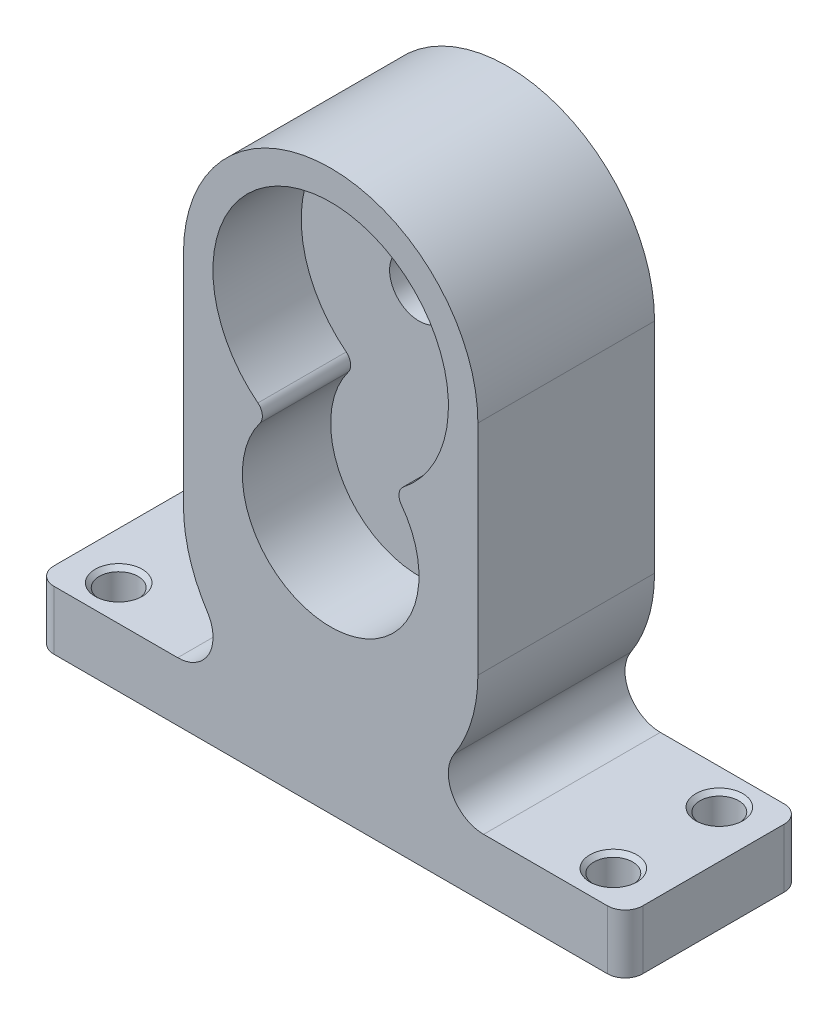
ISO-10303-21;
HEADER;
FILE_DESCRIPTION(('STEP AP214'),'2;1');
FILE_NAME('part.step','',(''),(''),'','','');
FILE_SCHEMA(('AUTOMOTIVE_DESIGN { 1 0 10303 214 1 1 1 1 }'));
ENDSEC;
DATA;
#1=APPLICATION_CONTEXT('core data for automotive mechanical design processes');
#2=APPLICATION_PROTOCOL_DEFINITION('international standard','automotive_design',2000,#1);
#3=PRODUCT_CONTEXT('',#1,'mechanical');
#4=PRODUCT('Part','Part','',(#3));
#5=PRODUCT_RELATED_PRODUCT_CATEGORY('part','',(#4));
#6=PRODUCT_DEFINITION_FORMATION('','',#4);
#7=PRODUCT_DEFINITION_CONTEXT('part definition',#1,'design');
#8=PRODUCT_DEFINITION('design','',#6,#7);
#9=PRODUCT_DEFINITION_SHAPE('','',#8);
#10=(LENGTH_UNIT() NAMED_UNIT(*) SI_UNIT(.MILLI.,.METRE.));
#11=(NAMED_UNIT(*) PLANE_ANGLE_UNIT() SI_UNIT($,.RADIAN.));
#12=(NAMED_UNIT(*) SI_UNIT($,.STERADIAN.) SOLID_ANGLE_UNIT());
#13=UNCERTAINTY_MEASURE_WITH_UNIT(LENGTH_MEASURE(1.E-05),#10,'distance_accuracy_value','');
#14=(GEOMETRIC_REPRESENTATION_CONTEXT(3) GLOBAL_UNCERTAINTY_ASSIGNED_CONTEXT((#13)) GLOBAL_UNIT_ASSIGNED_CONTEXT((#10,
#11,#12)) REPRESENTATION_CONTEXT('',''));
#15=CARTESIAN_POINT('',(0.,0.,0.));
#16=DIRECTION('',(0.,0.,1.));
#17=DIRECTION('',(1.,0.,0.));
#18=AXIS2_PLACEMENT_3D('',#15,#16,#17);
#19=CARTESIAN_POINT('',(-25.9798872533611,16.,-30.));
#20=DIRECTION('',(0.,0.,1.));
#21=DIRECTION('',(1.,0.,0.));
#22=AXIS2_PLACEMENT_3D('',#19,#20,#21);
#23=CYLINDRICAL_SURFACE('',#22,6.);
#24=DIRECTION('',(0.,0.,-1.));
#25=VECTOR('',#24,1.);
#26=CARTESIAN_POINT('',(-25.9798872533611,10.,-30.));
#27=LINE('',#26,#25);
#28=CARTESIAN_POINT('',(-25.9798872533611,10.,0.));
#29=VERTEX_POINT('',#28);
#30=CARTESIAN_POINT('',(-25.9798872533611,10.,-30.));
#31=VERTEX_POINT('',#30);
#32=EDGE_CURVE('E246',#29,#31,#27,.T.);
#33=ORIENTED_EDGE('',*,*,#32,.F.);
#34=CARTESIAN_POINT('',(-25.9798872533611,16.,0.));
#35=DIRECTION('',(0.,0.,-1.));
#36=DIRECTION('',(-1.,0.,0.));
#37=AXIS2_PLACEMENT_3D('',#34,#35,#36);
#38=CIRCLE('',#37,6.);
#39=CARTESIAN_POINT('',(-20.951521978517,19.2734603499573,0.));
#40=VERTEX_POINT('',#39);
#41=EDGE_CURVE('E252',#29,#40,#38,.F.);
#42=ORIENTED_EDGE('',*,*,#41,.T.);
#43=DIRECTION('',(0.,0.,1.));
#44=VECTOR('',#43,1.);
#45=CARTESIAN_POINT('',(-20.951521978517,19.2734603499573,-30.));
#46=LINE('',#45,#44);
#47=CARTESIAN_POINT('',(-20.951521978517,19.2734603499573,-30.));
#48=VERTEX_POINT('',#47);
#49=EDGE_CURVE('E249',#48,#40,#46,.T.);
#50=ORIENTED_EDGE('',*,*,#49,.F.);
#51=CARTESIAN_POINT('',(-25.9798872533611,16.,-30.));
#52=DIRECTION('',(0.,0.,-1.));
#53=DIRECTION('',(-1.,0.,0.));
#54=AXIS2_PLACEMENT_3D('',#51,#52,#53);
#55=CIRCLE('',#54,6.);
#56=EDGE_CURVE('E254',#48,#31,#55,.T.);
#57=ORIENTED_EDGE('',*,*,#56,.T.);
#58=EDGE_LOOP('',(#33,#42,#50,#57));
#59=FACE_BOUND('',#58,.T.);
#60=ADVANCED_FACE('F34',(#59),#23,.F.);
#61=CARTESIAN_POINT('',(25.9798872533611,16.,-30.));
#62=DIRECTION('',(0.,0.,1.));
#63=DIRECTION('',(1.,0.,0.));
#64=AXIS2_PLACEMENT_3D('',#61,#62,#63);
#65=CYLINDRICAL_SURFACE('',#64,6.);
#66=DIRECTION('',(0.,0.,-1.));
#67=VECTOR('',#66,1.);
#68=CARTESIAN_POINT('',(25.9798872533611,10.,-30.));
#69=LINE('',#68,#67);
#70=CARTESIAN_POINT('',(25.9798872533611,10.,-30.));
#71=VERTEX_POINT('',#70);
#72=CARTESIAN_POINT('',(25.9798872533611,10.,0.));
#73=VERTEX_POINT('',#72);
#74=EDGE_CURVE('E228',#71,#73,#69,.F.);
#75=ORIENTED_EDGE('',*,*,#74,.F.);
#76=CARTESIAN_POINT('',(25.9798872533611,16.,-30.));
#77=DIRECTION('',(0.,0.,-1.));
#78=DIRECTION('',(-1.,0.,0.));
#79=AXIS2_PLACEMENT_3D('',#76,#77,#78);
#80=CIRCLE('',#79,6.);
#81=CARTESIAN_POINT('',(20.951521978517,19.2734603499573,-30.));
#82=VERTEX_POINT('',#81);
#83=EDGE_CURVE('E241',#71,#82,#80,.T.);
#84=ORIENTED_EDGE('',*,*,#83,.T.);
#85=DIRECTION('',(0.,0.,1.));
#86=VECTOR('',#85,1.);
#87=CARTESIAN_POINT('',(20.951521978517,19.2734603499573,-30.));
#88=LINE('',#87,#86);
#89=CARTESIAN_POINT('',(20.951521978517,19.2734603499573,0.));
#90=VERTEX_POINT('',#89);
#91=EDGE_CURVE('E238',#90,#82,#88,.F.);
#92=ORIENTED_EDGE('',*,*,#91,.F.);
#93=CARTESIAN_POINT('',(25.9798872533611,16.,0.));
#94=DIRECTION('',(0.,0.,-1.));
#95=DIRECTION('',(-1.,0.,0.));
#96=AXIS2_PLACEMENT_3D('',#93,#94,#95);
#97=CIRCLE('',#96,6.);
#98=EDGE_CURVE('E243',#90,#73,#97,.F.);
#99=ORIENTED_EDGE('',*,*,#98,.T.);
#100=EDGE_LOOP('',(#75,#84,#92,#99));
#101=FACE_BOUND('',#100,.T.);
#102=ADVANCED_FACE('F422',(#101),#65,.F.);
#103=CARTESIAN_POINT('',(0.,0.,-30.));
#104=DIRECTION('',(0.,-1.,0.));
#105=DIRECTION('',(0.,0.,-1.));
#106=AXIS2_PLACEMENT_3D('',#103,#104,#105);
#107=PLANE('',#106);
#108=CARTESIAN_POINT('',(-42.,0.,-6.));
#109=DIRECTION('',(0.,1.,0.));
#110=DIRECTION('',(0.,0.,1.));
#111=AXIS2_PLACEMENT_3D('',#108,#109,#110);
#112=CIRCLE('',#111,3.29999999999998);
#113=CARTESIAN_POINT('',(-42.,0.,-2.70000000000002));
#114=VERTEX_POINT('',#113);
#115=EDGE_CURVE('E386',#114,#114,#112,.T.);
#116=ORIENTED_EDGE('',*,*,#115,.T.);
#117=EDGE_LOOP('',(#116));
#118=FACE_BOUND('',#117,.T.);
#119=CARTESIAN_POINT('',(42.,0.,-6.));
#120=DIRECTION('',(0.,1.,0.));
#121=DIRECTION('',(0.,0.,1.));
#122=AXIS2_PLACEMENT_3D('',#119,#120,#121);
#123=CIRCLE('',#122,3.29999999999998);
#124=CARTESIAN_POINT('',(42.,0.,-2.70000000000002));
#125=VERTEX_POINT('',#124);
#126=EDGE_CURVE('E377',#125,#125,#123,.T.);
#127=ORIENTED_EDGE('',*,*,#126,.T.);
#128=EDGE_LOOP('',(#127));
#129=FACE_BOUND('',#128,.T.);
#130=CARTESIAN_POINT('',(-42.,0.,-24.));
#131=DIRECTION('',(0.,1.,0.));
#132=DIRECTION('',(0.,0.,1.));
#133=AXIS2_PLACEMENT_3D('',#130,#131,#132);
#134=CIRCLE('',#133,3.29999999999998);
#135=CARTESIAN_POINT('',(-42.,0.,-20.7));
#136=VERTEX_POINT('',#135);
#137=EDGE_CURVE('E368',#136,#136,#134,.T.);
#138=ORIENTED_EDGE('',*,*,#137,.T.);
#139=EDGE_LOOP('',(#138));
#140=FACE_BOUND('',#139,.T.);
#141=CARTESIAN_POINT('',(42.,0.,-24.));
#142=DIRECTION('',(0.,1.,0.));
#143=DIRECTION('',(0.,0.,1.));
#144=AXIS2_PLACEMENT_3D('',#141,#142,#143);
#145=CIRCLE('',#144,3.29999999999998);
#146=CARTESIAN_POINT('',(42.,0.,-20.7));
#147=VERTEX_POINT('',#146);
#148=EDGE_CURVE('E357',#147,#147,#145,.T.);
#149=ORIENTED_EDGE('',*,*,#148,.T.);
#150=EDGE_LOOP('',(#149));
#151=FACE_BOUND('',#150,.T.);
#152=DIRECTION('',(0.,0.,1.));
#153=VECTOR('',#152,1.);
#154=CARTESIAN_POINT('',(-50.,0.,-30.));
#155=LINE('',#154,#153);
#156=CARTESIAN_POINT('',(-50.,0.,-27.));
#157=VERTEX_POINT('',#156);
#158=CARTESIAN_POINT('',(-50.,0.,-3.));
#159=VERTEX_POINT('',#158);
#160=EDGE_CURVE('E219',#157,#159,#155,.T.);
#161=ORIENTED_EDGE('',*,*,#160,.F.);
#162=CARTESIAN_POINT('',(-47.,0.,-27.));
#163=DIRECTION('',(0.,-1.,0.));
#164=DIRECTION('',(0.,0.,-1.));
#165=AXIS2_PLACEMENT_3D('',#162,#163,#164);
#166=CIRCLE('',#165,3.);
#167=CARTESIAN_POINT('',(-47.,0.,-30.));
#168=VERTEX_POINT('',#167);
#169=EDGE_CURVE('E300',#157,#168,#166,.T.);
#170=ORIENTED_EDGE('',*,*,#169,.T.);
#171=DIRECTION('',(1.,0.,0.));
#172=VECTOR('',#171,1.);
#173=CARTESIAN_POINT('',(0.,0.,-30.));
#174=LINE('',#173,#172);
#175=CARTESIAN_POINT('',(47.,0.,-30.));
#176=VERTEX_POINT('',#175);
#177=EDGE_CURVE('E206',#168,#176,#174,.T.);
#178=ORIENTED_EDGE('',*,*,#177,.T.);
#179=CARTESIAN_POINT('',(47.,0.,-27.));
#180=DIRECTION('',(0.,-1.,0.));
#181=DIRECTION('',(0.,0.,-1.));
#182=AXIS2_PLACEMENT_3D('',#179,#180,#181);
#183=CIRCLE('',#182,3.);
#184=CARTESIAN_POINT('',(50.,0.,-27.));
#185=VERTEX_POINT('',#184);
#186=EDGE_CURVE('E296',#176,#185,#183,.T.);
#187=ORIENTED_EDGE('',*,*,#186,.T.);
#188=DIRECTION('',(0.,0.,1.));
#189=VECTOR('',#188,1.);
#190=CARTESIAN_POINT('',(50.,0.,-30.));
#191=LINE('',#190,#189);
#192=CARTESIAN_POINT('',(50.,0.,-3.));
#193=VERTEX_POINT('',#192);
#194=EDGE_CURVE('E180',#185,#193,#191,.T.);
#195=ORIENTED_EDGE('',*,*,#194,.T.);
#196=CARTESIAN_POINT('',(47.,0.,-3.));
#197=DIRECTION('',(0.,-1.,0.));
#198=DIRECTION('',(0.,0.,-1.));
#199=AXIS2_PLACEMENT_3D('',#196,#197,#198);
#200=CIRCLE('',#199,3.);
#201=CARTESIAN_POINT('',(47.,0.,0.));
#202=VERTEX_POINT('',#201);
#203=EDGE_CURVE('E294',#193,#202,#200,.T.);
#204=ORIENTED_EDGE('',*,*,#203,.T.);
#205=DIRECTION('',(1.,0.,0.));
#206=VECTOR('',#205,1.);
#207=CARTESIAN_POINT('',(0.,0.,0.));
#208=LINE('',#207,#206);
#209=CARTESIAN_POINT('',(-47.,0.,0.));
#210=VERTEX_POINT('',#209);
#211=EDGE_CURVE('E215',#210,#202,#208,.T.);
#212=ORIENTED_EDGE('',*,*,#211,.F.);
#213=CARTESIAN_POINT('',(-47.,0.,-3.));
#214=DIRECTION('',(0.,-1.,0.));
#215=DIRECTION('',(0.,0.,-1.));
#216=AXIS2_PLACEMENT_3D('',#213,#214,#215);
#217=CIRCLE('',#216,3.);
#218=EDGE_CURVE('E298',#210,#159,#217,.T.);
#219=ORIENTED_EDGE('',*,*,#218,.T.);
#220=EDGE_LOOP('',(#161,#170,#178,#187,#195,#204,#212,#219));
#221=FACE_BOUND('',#220,.T.);
#222=ADVANCED_FACE('F323',(#118,#129,#140,#151,#221),#107,.T.);
#223=CARTESIAN_POINT('',(2.86934745040225E-13,70.0000000000001,-30.));
#224=DIRECTION('',(0.,0.,1.));
#225=DIRECTION('',(1.,0.,0.));
#226=AXIS2_PLACEMENT_3D('',#223,#224,#225);
#227=CYLINDRICAL_SURFACE('',#226,24.9999999999999);
#228=CARTESIAN_POINT('',(2.86934745040225E-13,70.0000000000001,0.));
#229=DIRECTION('',(0.,0.,1.));
#230=DIRECTION('',(1.,0.,0.));
#231=AXIS2_PLACEMENT_3D('',#228,#229,#230);
#232=CIRCLE('',#231,24.9999999999999);
#233=CARTESIAN_POINT('',(25.0000000000002,70.,0.));
#234=VERTEX_POINT('',#233);
#235=CARTESIAN_POINT('',(-25.0000000000002,70.,0.));
#236=VERTEX_POINT('',#235);
#237=EDGE_CURVE('E210',#234,#236,#232,.T.);
#238=ORIENTED_EDGE('',*,*,#237,.F.);
#239=DIRECTION('',(0.,0.,1.));
#240=VECTOR('',#239,1.);
#241=CARTESIAN_POINT('',(25.0000000000002,70.,-30.));
#242=LINE('',#241,#240);
#243=CARTESIAN_POINT('',(25.0000000000002,70.,-30.));
#244=VERTEX_POINT('',#243);
#245=EDGE_CURVE('E176',#244,#234,#242,.T.);
#246=ORIENTED_EDGE('',*,*,#245,.F.);
#247=CARTESIAN_POINT('',(2.86934745040225E-13,70.0000000000001,-30.));
#248=DIRECTION('',(0.,0.,1.));
#249=DIRECTION('',(1.,0.,0.));
#250=AXIS2_PLACEMENT_3D('',#247,#248,#249);
#251=CIRCLE('',#250,24.9999999999999);
#252=CARTESIAN_POINT('',(-25.0000000000002,70.,-30.));
#253=VERTEX_POINT('',#252);
#254=EDGE_CURVE('E170',#244,#253,#251,.T.);
#255=ORIENTED_EDGE('',*,*,#254,.T.);
#256=DIRECTION('',(0.,0.,1.));
#257=VECTOR('',#256,1.);
#258=CARTESIAN_POINT('',(-25.0000000000002,70.,-30.));
#259=LINE('',#258,#257);
#260=EDGE_CURVE('E175',#253,#236,#259,.T.);
#261=ORIENTED_EDGE('',*,*,#260,.T.);
#262=EDGE_LOOP('',(#238,#246,#255,#261));
#263=FACE_BOUND('',#262,.T.);
#264=ADVANCED_FACE('F173',(#263),#227,.T.);
#265=CARTESIAN_POINT('',(25.0000000000001,70.,-30.));
#266=DIRECTION('',(1.,0.,0.));
#267=DIRECTION('',(0.,0.,-1.));
#268=AXIS2_PLACEMENT_3D('',#265,#266,#267);
#269=PLANE('',#268);
#270=DIRECTION('',(0.,1.,0.));
#271=VECTOR('',#270,1.);
#272=CARTESIAN_POINT('',(25.0000000000001,70.,0.));
#273=LINE('',#272,#271);
#274=CARTESIAN_POINT('',(25.0000000000001,32.9128784747792,0.));
#275=VERTEX_POINT('',#274);
#276=EDGE_CURVE('E223',#275,#234,#273,.T.);
#277=ORIENTED_EDGE('',*,*,#276,.F.);
#278=DIRECTION('',(0.,0.,1.));
#279=VECTOR('',#278,1.);
#280=CARTESIAN_POINT('',(25.0000000000001,32.9128784747792,-30.));
#281=LINE('',#280,#279);
#282=CARTESIAN_POINT('',(25.0000000000001,32.9128784747792,-30.));
#283=VERTEX_POINT('',#282);
#284=EDGE_CURVE('E229',#283,#275,#281,.T.);
#285=ORIENTED_EDGE('',*,*,#284,.F.);
#286=DIRECTION('',(0.,1.,0.));
#287=VECTOR('',#286,1.);
#288=CARTESIAN_POINT('',(25.0000000000001,70.,-30.));
#289=LINE('',#288,#287);
#290=EDGE_CURVE('E181',#283,#244,#289,.T.);
#291=ORIENTED_EDGE('',*,*,#290,.T.);
#292=ORIENTED_EDGE('',*,*,#245,.T.);
#293=EDGE_LOOP('',(#277,#285,#291,#292));
#294=FACE_BOUND('',#293,.T.);
#295=ADVANCED_FACE('F470',(#294),#269,.T.);
#296=CARTESIAN_POINT('',(0.,32.9128784747792,-30.));
#297=DIRECTION('',(0.,0.,1.));
#298=DIRECTION('',(1.,0.,0.));
#299=AXIS2_PLACEMENT_3D('',#296,#297,#298);
#300=CYLINDRICAL_SURFACE('',#299,25.0000000000001);
#301=CARTESIAN_POINT('',(0.,32.9128784747792,0.));
#302=DIRECTION('',(0.,0.,1.));
#303=DIRECTION('',(-1.,0.,0.));
#304=AXIS2_PLACEMENT_3D('',#301,#302,#303);
#305=CIRCLE('',#304,25.0000000000001);
#306=EDGE_CURVE('E221',#90,#275,#305,.T.);
#307=ORIENTED_EDGE('',*,*,#306,.F.);
#308=ORIENTED_EDGE('',*,*,#91,.T.);
#309=CARTESIAN_POINT('',(0.,32.9128784747792,-30.));
#310=DIRECTION('',(0.,0.,1.));
#311=DIRECTION('',(-1.,0.,0.));
#312=AXIS2_PLACEMENT_3D('',#309,#310,#311);
#313=CIRCLE('',#312,25.0000000000001);
#314=EDGE_CURVE('E212',#82,#283,#313,.T.);
#315=ORIENTED_EDGE('',*,*,#314,.T.);
#316=ORIENTED_EDGE('',*,*,#284,.T.);
#317=EDGE_LOOP('',(#307,#308,#315,#316));
#318=FACE_BOUND('',#317,.T.);
#319=ADVANCED_FACE('F472',(#318),#300,.T.);
#320=CARTESIAN_POINT('',(10.,9.99999999999999,-30.));
#321=DIRECTION('',(0.,1.,0.));
#322=DIRECTION('',(-1.,0.,0.));
#323=AXIS2_PLACEMENT_3D('',#320,#321,#322);
#324=PLANE('',#323);
#325=CARTESIAN_POINT('',(42.,10.,-6.));
#326=DIRECTION('',(0.,1.,0.));
#327=DIRECTION('',(0.,0.,1.));
#328=AXIS2_PLACEMENT_3D('',#325,#326,#327);
#329=CIRCLE('',#328,4.);
#330=CARTESIAN_POINT('',(42.,10.,-2.00000000000001));
#331=VERTEX_POINT('',#330);
#332=EDGE_CURVE('E383',#331,#331,#329,.T.);
#333=ORIENTED_EDGE('',*,*,#332,.F.);
#334=EDGE_LOOP('',(#333));
#335=FACE_BOUND('',#334,.T.);
#336=CARTESIAN_POINT('',(42.,10.,-24.));
#337=DIRECTION('',(0.,1.,0.));
#338=DIRECTION('',(0.,0.,1.));
#339=AXIS2_PLACEMENT_3D('',#336,#337,#338);
#340=CIRCLE('',#339,4.);
#341=CARTESIAN_POINT('',(42.,10.,-20.));
#342=VERTEX_POINT('',#341);
#343=EDGE_CURVE('E365',#342,#342,#340,.T.);
#344=ORIENTED_EDGE('',*,*,#343,.F.);
#345=EDGE_LOOP('',(#344));
#346=FACE_BOUND('',#345,.T.);
#347=DIRECTION('',(0.,0.,1.));
#348=VECTOR('',#347,1.);
#349=CARTESIAN_POINT('',(50.,10.,-30.));
#350=LINE('',#349,#348);
#351=CARTESIAN_POINT('',(50.,10.,-27.));
#352=VERTEX_POINT('',#351);
#353=CARTESIAN_POINT('',(50.,10.,-3.));
#354=VERTEX_POINT('',#353);
#355=EDGE_CURVE('E232',#352,#354,#350,.T.);
#356=ORIENTED_EDGE('',*,*,#355,.F.);
#357=CARTESIAN_POINT('',(47.,10.,-27.));
#358=DIRECTION('',(0.,1.,0.));
#359=DIRECTION('',(-1.,0.,0.));
#360=AXIS2_PLACEMENT_3D('',#357,#358,#359);
#361=CIRCLE('',#360,3.);
#362=CARTESIAN_POINT('',(47.,10.,-30.));
#363=VERTEX_POINT('',#362);
#364=EDGE_CURVE('E11',#352,#363,#361,.T.);
#365=ORIENTED_EDGE('',*,*,#364,.T.);
#366=DIRECTION('',(-1.,0.,0.));
#367=VECTOR('',#366,1.);
#368=CARTESIAN_POINT('',(10.,9.99999999999999,-30.));
#369=LINE('',#368,#367);
#370=EDGE_CURVE('E209',#363,#71,#369,.T.);
#371=ORIENTED_EDGE('',*,*,#370,.T.);
#372=ORIENTED_EDGE('',*,*,#74,.T.);
#373=DIRECTION('',(-1.,0.,0.));
#374=VECTOR('',#373,1.);
#375=CARTESIAN_POINT('',(10.,9.99999999999999,0.));
#376=LINE('',#375,#374);
#377=CARTESIAN_POINT('',(47.,10.,0.));
#378=VERTEX_POINT('',#377);
#379=EDGE_CURVE('E218',#378,#73,#376,.T.);
#380=ORIENTED_EDGE('',*,*,#379,.F.);
#381=CARTESIAN_POINT('',(47.,10.,-3.));
#382=DIRECTION('',(0.,1.,0.));
#383=DIRECTION('',(-1.,0.,0.));
#384=AXIS2_PLACEMENT_3D('',#381,#382,#383);
#385=CIRCLE('',#384,3.);
#386=EDGE_CURVE('E42',#378,#354,#385,.T.);
#387=ORIENTED_EDGE('',*,*,#386,.T.);
#388=EDGE_LOOP('',(#356,#365,#371,#372,#380,#387));
#389=FACE_BOUND('',#388,.T.);
#390=ADVANCED_FACE('F315',(#335,#346,#389),#324,.T.);
#391=CARTESIAN_POINT('',(50.,10.,-30.));
#392=DIRECTION('',(1.,0.,0.));
#393=DIRECTION('',(0.,0.,-1.));
#394=AXIS2_PLACEMENT_3D('',#391,#392,#393);
#395=PLANE('',#394);
#396=ORIENTED_EDGE('',*,*,#194,.F.);
#397=DIRECTION('',(0.,1.,0.));
#398=VECTOR('',#397,1.);
#399=CARTESIAN_POINT('',(50.,10.,-27.));
#400=LINE('',#399,#398);
#401=EDGE_CURVE('E309',#185,#352,#400,.T.);
#402=ORIENTED_EDGE('',*,*,#401,.T.);
#403=ORIENTED_EDGE('',*,*,#355,.T.);
#404=DIRECTION('',(0.,1.,0.));
#405=VECTOR('',#404,1.);
#406=CARTESIAN_POINT('',(50.,0.,-3.));
#407=LINE('',#406,#405);
#408=EDGE_CURVE('E307',#354,#193,#407,.F.);
#409=ORIENTED_EDGE('',*,*,#408,.T.);
#410=EDGE_LOOP('',(#396,#402,#403,#409));
#411=FACE_BOUND('',#410,.T.);
#412=ADVANCED_FACE('F312',(#411),#395,.T.);
#413=CARTESIAN_POINT('',(0.,32.9128784747792,-30.));
#414=DIRECTION('',(0.,0.,-1.));
#415=DIRECTION('',(-1.,0.,0.));
#416=AXIS2_PLACEMENT_3D('',#413,#414,#415);
#417=PLANE('',#416);
#418=CARTESIAN_POINT('',(2.86934745040225E-13,70.0000000000001,-30.));
#419=DIRECTION('',(0.,0.,1.));
#420=DIRECTION('',(1.,0.,0.));
#421=AXIS2_PLACEMENT_3D('',#418,#419,#420);
#422=CIRCLE('',#421,5.);
#423=CARTESIAN_POINT('',(5.00000000000029,70.0000000000001,-30.));
#424=VERTEX_POINT('',#423);
#425=EDGE_CURVE('E262',#424,#424,#422,.T.);
#426=ORIENTED_EDGE('',*,*,#425,.T.);
#427=EDGE_LOOP('',(#426));
#428=FACE_BOUND('',#427,.T.);
#429=ORIENTED_EDGE('',*,*,#177,.F.);
#430=DIRECTION('',(0.,1.,0.));
#431=VECTOR('',#430,1.);
#432=CARTESIAN_POINT('',(-47.,10.,-30.));
#433=LINE('',#432,#431);
#434=CARTESIAN_POINT('',(-47.,10.,-30.));
#435=VERTEX_POINT('',#434);
#436=EDGE_CURVE('E282',#168,#435,#433,.T.);
#437=ORIENTED_EDGE('',*,*,#436,.T.);
#438=DIRECTION('',(1.,0.,0.));
#439=VECTOR('',#438,1.);
#440=CARTESIAN_POINT('',(-10.,9.99999999999999,-30.));
#441=LINE('',#440,#439);
#442=EDGE_CURVE('E199',#435,#31,#441,.T.);
#443=ORIENTED_EDGE('',*,*,#442,.T.);
#444=ORIENTED_EDGE('',*,*,#56,.F.);
#445=CARTESIAN_POINT('',(0.,32.9128784747792,-30.));
#446=DIRECTION('',(0.,0.,-1.));
#447=DIRECTION('',(1.,0.,0.));
#448=AXIS2_PLACEMENT_3D('',#445,#446,#447);
#449=CIRCLE('',#448,25.0000000000001);
#450=CARTESIAN_POINT('',(-25.0000000000001,32.9128784747792,-30.));
#451=VERTEX_POINT('',#450);
#452=EDGE_CURVE('E188',#48,#451,#449,.T.);
#453=ORIENTED_EDGE('',*,*,#452,.T.);
#454=DIRECTION('',(0.,1.,0.));
#455=VECTOR('',#454,1.);
#456=CARTESIAN_POINT('',(-25.0000000000001,70.,-30.));
#457=LINE('',#456,#455);
#458=EDGE_CURVE('E184',#451,#253,#457,.T.);
#459=ORIENTED_EDGE('',*,*,#458,.T.);
#460=ORIENTED_EDGE('',*,*,#254,.F.);
#461=ORIENTED_EDGE('',*,*,#290,.F.);
#462=ORIENTED_EDGE('',*,*,#314,.F.);
#463=ORIENTED_EDGE('',*,*,#83,.F.);
#464=ORIENTED_EDGE('',*,*,#370,.F.);
#465=DIRECTION('',(0.,1.,0.));
#466=VECTOR('',#465,1.);
#467=CARTESIAN_POINT('',(47.,32.9128784747792,-30.));
#468=LINE('',#467,#466);
#469=EDGE_CURVE('E280',#363,#176,#468,.F.);
#470=ORIENTED_EDGE('',*,*,#469,.T.);
#471=EDGE_LOOP('',(#429,#437,#443,#444,#453,#459,#460,#461,#462,#463,#464,#470));
#472=FACE_BOUND('',#471,.T.);
#473=ADVANCED_FACE('F186',(#428,#472),#417,.T.);
#474=CARTESIAN_POINT('',(0.,32.9128784747792,0.));
#475=DIRECTION('',(0.,0.,-1.));
#476=DIRECTION('',(-1.,0.,0.));
#477=AXIS2_PLACEMENT_3D('',#474,#475,#476);
#478=PLANE('',#477);
#479=CARTESIAN_POINT('',(0.,42.5,0.));
#480=DIRECTION('',(0.,0.,1.));
#481=DIRECTION('',(1.,0.,0.));
#482=AXIS2_PLACEMENT_3D('',#479,#480,#481);
#483=CIRCLE('',#482,15.);
#484=CARTESIAN_POINT('',(-11.9969909311024,51.5040106951873,0.));
#485=VERTEX_POINT('',#484);
#486=CARTESIAN_POINT('',(11.9969909311025,51.5040106951871,0.));
#487=VERTEX_POINT('',#486);
#488=EDGE_CURVE('E354',#485,#487,#483,.T.);
#489=ORIENTED_EDGE('',*,*,#488,.F.);
#490=CARTESIAN_POINT('',(-13.596589721916,52.7045454545456,0.));
#491=DIRECTION('',(0.,0.,-1.));
#492=DIRECTION('',(-1.,0.,0.));
#493=AXIS2_PLACEMENT_3D('',#490,#491,#492);
#494=CIRCLE('',#493,2.);
#495=CARTESIAN_POINT('',(-12.3605361108327,54.2768595041324,0.));
#496=VERTEX_POINT('',#495);
#497=EDGE_CURVE('E274',#485,#496,#494,.F.);
#498=ORIENTED_EDGE('',*,*,#497,.T.);
#499=CARTESIAN_POINT('',(2.86934745040225E-13,70.0000000000001,0.));
#500=DIRECTION('',(0.,0.,1.));
#501=DIRECTION('',(1.,0.,0.));
#502=AXIS2_PLACEMENT_3D('',#499,#500,#501);
#503=CIRCLE('',#502,20.);
#504=CARTESIAN_POINT('',(12.360536110833,54.2768595041321,0.));
#505=VERTEX_POINT('',#504);
#506=EDGE_CURVE('E261',#505,#496,#503,.T.);
#507=ORIENTED_EDGE('',*,*,#506,.F.);
#508=CARTESIAN_POINT('',(13.5965897219162,52.7045454545454,0.));
#509=DIRECTION('',(0.,0.,-1.));
#510=DIRECTION('',(-1.,0.,0.));
#511=AXIS2_PLACEMENT_3D('',#508,#509,#510);
#512=CIRCLE('',#511,2.);
#513=EDGE_CURVE('E272',#505,#487,#512,.F.);
#514=ORIENTED_EDGE('',*,*,#513,.T.);
#515=EDGE_LOOP('',(#489,#498,#507,#514));
#516=FACE_BOUND('',#515,.T.);
#517=DIRECTION('',(1.,0.,0.));
#518=VECTOR('',#517,1.);
#519=CARTESIAN_POINT('',(-10.,9.99999999999999,0.));
#520=LINE('',#519,#518);
#521=CARTESIAN_POINT('',(-47.,10.,0.));
#522=VERTEX_POINT('',#521);
#523=EDGE_CURVE('E192',#522,#29,#520,.T.);
#524=ORIENTED_EDGE('',*,*,#523,.F.);
#525=DIRECTION('',(0.,1.,0.));
#526=VECTOR('',#525,1.);
#527=CARTESIAN_POINT('',(-47.,32.9128784747792,0.));
#528=LINE('',#527,#526);
#529=EDGE_CURVE('E305',#522,#210,#528,.F.);
#530=ORIENTED_EDGE('',*,*,#529,.T.);
#531=ORIENTED_EDGE('',*,*,#211,.T.);
#532=DIRECTION('',(0.,1.,0.));
#533=VECTOR('',#532,1.);
#534=CARTESIAN_POINT('',(47.,10.,0.));
#535=LINE('',#534,#533);
#536=EDGE_CURVE('E302',#202,#378,#535,.T.);
#537=ORIENTED_EDGE('',*,*,#536,.T.);
#538=ORIENTED_EDGE('',*,*,#379,.T.);
#539=ORIENTED_EDGE('',*,*,#98,.F.);
#540=ORIENTED_EDGE('',*,*,#306,.T.);
#541=ORIENTED_EDGE('',*,*,#276,.T.);
#542=ORIENTED_EDGE('',*,*,#237,.T.);
#543=DIRECTION('',(0.,1.,0.));
#544=VECTOR('',#543,1.);
#545=CARTESIAN_POINT('',(-25.0000000000001,70.,0.));
#546=LINE('',#545,#544);
#547=CARTESIAN_POINT('',(-25.0000000000001,32.9128784747792,0.));
#548=VERTEX_POINT('',#547);
#549=EDGE_CURVE('E197',#548,#236,#546,.T.);
#550=ORIENTED_EDGE('',*,*,#549,.F.);
#551=CARTESIAN_POINT('',(0.,32.9128784747792,0.));
#552=DIRECTION('',(0.,0.,-1.));
#553=DIRECTION('',(1.,0.,0.));
#554=AXIS2_PLACEMENT_3D('',#551,#552,#553);
#555=CIRCLE('',#554,25.0000000000001);
#556=EDGE_CURVE('E342',#40,#548,#555,.T.);
#557=ORIENTED_EDGE('',*,*,#556,.F.);
#558=ORIENTED_EDGE('',*,*,#41,.F.);
#559=EDGE_LOOP('',(#524,#530,#531,#537,#538,#539,#540,#541,#542,#550,#557,#558));
#560=FACE_BOUND('',#559,.T.);
#561=ADVANCED_FACE('F460',(#516,#560),#478,.F.);
#562=CARTESIAN_POINT('',(-50.,10.,-30.));
#563=DIRECTION('',(1.,0.,0.));
#564=DIRECTION('',(0.,0.,-1.));
#565=AXIS2_PLACEMENT_3D('',#562,#563,#564);
#566=PLANE('',#565);
#567=DIRECTION('',(0.,0.,1.));
#568=VECTOR('',#567,1.);
#569=CARTESIAN_POINT('',(-50.,10.,-30.));
#570=LINE('',#569,#568);
#571=CARTESIAN_POINT('',(-50.,10.,-27.));
#572=VERTEX_POINT('',#571);
#573=CARTESIAN_POINT('',(-50.,10.,-3.));
#574=VERTEX_POINT('',#573);
#575=EDGE_CURVE('E201',#572,#574,#570,.T.);
#576=ORIENTED_EDGE('',*,*,#575,.F.);
#577=DIRECTION('',(0.,1.,0.));
#578=VECTOR('',#577,1.);
#579=CARTESIAN_POINT('',(-50.,0.,-27.));
#580=LINE('',#579,#578);
#581=EDGE_CURVE('E292',#572,#157,#580,.F.);
#582=ORIENTED_EDGE('',*,*,#581,.T.);
#583=ORIENTED_EDGE('',*,*,#160,.T.);
#584=DIRECTION('',(0.,1.,0.));
#585=VECTOR('',#584,1.);
#586=CARTESIAN_POINT('',(-50.,10.,-3.));
#587=LINE('',#586,#585);
#588=EDGE_CURVE('E289',#159,#574,#587,.T.);
#589=ORIENTED_EDGE('',*,*,#588,.T.);
#590=EDGE_LOOP('',(#576,#582,#583,#589));
#591=FACE_BOUND('',#590,.T.);
#592=ADVANCED_FACE('F336',(#591),#566,.F.);
#593=CARTESIAN_POINT('',(-10.,9.99999999999999,-30.));
#594=DIRECTION('',(0.,-1.,0.));
#595=DIRECTION('',(1.,0.,0.));
#596=AXIS2_PLACEMENT_3D('',#593,#594,#595);
#597=PLANE('',#596);
#598=CARTESIAN_POINT('',(-42.,9.99999999999999,-6.));
#599=DIRECTION('',(0.,1.,0.));
#600=DIRECTION('',(0.,0.,1.));
#601=AXIS2_PLACEMENT_3D('',#598,#599,#600);
#602=CIRCLE('',#601,4.);
#603=CARTESIAN_POINT('',(-42.,9.99999999999999,-2.00000000000001));
#604=VERTEX_POINT('',#603);
#605=EDGE_CURVE('E392',#604,#604,#602,.T.);
#606=ORIENTED_EDGE('',*,*,#605,.F.);
#607=EDGE_LOOP('',(#606));
#608=FACE_BOUND('',#607,.T.);
#609=CARTESIAN_POINT('',(-42.,9.99999999999999,-24.));
#610=DIRECTION('',(0.,1.,0.));
#611=DIRECTION('',(0.,0.,1.));
#612=AXIS2_PLACEMENT_3D('',#609,#610,#611);
#613=CIRCLE('',#612,4.);
#614=CARTESIAN_POINT('',(-42.,9.99999999999999,-20.));
#615=VERTEX_POINT('',#614);
#616=EDGE_CURVE('E374',#615,#615,#613,.T.);
#617=ORIENTED_EDGE('',*,*,#616,.F.);
#618=EDGE_LOOP('',(#617));
#619=FACE_BOUND('',#618,.T.);
#620=ORIENTED_EDGE('',*,*,#442,.F.);
#621=CARTESIAN_POINT('',(-47.,10.,-27.));
#622=DIRECTION('',(0.,-1.,0.));
#623=DIRECTION('',(1.,0.,0.));
#624=AXIS2_PLACEMENT_3D('',#621,#622,#623);
#625=CIRCLE('',#624,3.);
#626=EDGE_CURVE('E287',#435,#572,#625,.F.);
#627=ORIENTED_EDGE('',*,*,#626,.T.);
#628=ORIENTED_EDGE('',*,*,#575,.T.);
#629=CARTESIAN_POINT('',(-47.,10.,-3.));
#630=DIRECTION('',(0.,-1.,0.));
#631=DIRECTION('',(1.,0.,0.));
#632=AXIS2_PLACEMENT_3D('',#629,#630,#631);
#633=CIRCLE('',#632,3.);
#634=EDGE_CURVE('E285',#574,#522,#633,.F.);
#635=ORIENTED_EDGE('',*,*,#634,.T.);
#636=ORIENTED_EDGE('',*,*,#523,.T.);
#637=ORIENTED_EDGE('',*,*,#32,.T.);
#638=EDGE_LOOP('',(#620,#627,#628,#635,#636,#637));
#639=FACE_BOUND('',#638,.T.);
#640=ADVANCED_FACE('F334',(#608,#619,#639),#597,.F.);
#641=CARTESIAN_POINT('',(0.,32.9128784747792,-30.));
#642=DIRECTION('',(0.,0.,1.));
#643=DIRECTION('',(1.,0.,0.));
#644=AXIS2_PLACEMENT_3D('',#641,#642,#643);
#645=CYLINDRICAL_SURFACE('',#644,25.0000000000001);
#646=ORIENTED_EDGE('',*,*,#452,.F.);
#647=ORIENTED_EDGE('',*,*,#49,.T.);
#648=ORIENTED_EDGE('',*,*,#556,.T.);
#649=DIRECTION('',(0.,0.,1.));
#650=VECTOR('',#649,1.);
#651=CARTESIAN_POINT('',(-25.0000000000001,32.9128784747792,-30.));
#652=LINE('',#651,#650);
#653=EDGE_CURVE('E198',#451,#548,#652,.T.);
#654=ORIENTED_EDGE('',*,*,#653,.F.);
#655=EDGE_LOOP('',(#646,#647,#648,#654));
#656=FACE_BOUND('',#655,.T.);
#657=ADVANCED_FACE('F400',(#656),#645,.T.);
#658=CARTESIAN_POINT('',(-25.0000000000001,70.,-30.));
#659=DIRECTION('',(1.,0.,0.));
#660=DIRECTION('',(0.,0.,-1.));
#661=AXIS2_PLACEMENT_3D('',#658,#659,#660);
#662=PLANE('',#661);
#663=ORIENTED_EDGE('',*,*,#549,.T.);
#664=ORIENTED_EDGE('',*,*,#260,.F.);
#665=ORIENTED_EDGE('',*,*,#458,.F.);
#666=ORIENTED_EDGE('',*,*,#653,.T.);
#667=EDGE_LOOP('',(#663,#664,#665,#666));
#668=FACE_BOUND('',#667,.T.);
#669=ADVANCED_FACE('F195',(#668),#662,.F.);
#670=CARTESIAN_POINT('',(2.86934745040225E-13,70.0000000000001,-15.));
#671=DIRECTION('',(0.,0.,1.));
#672=DIRECTION('',(1.,0.,0.));
#673=AXIS2_PLACEMENT_3D('',#670,#671,#672);
#674=CYLINDRICAL_SURFACE('',#673,20.);
#675=ORIENTED_EDGE('',*,*,#506,.T.);
#676=DIRECTION('',(0.,0.,1.));
#677=VECTOR('',#676,1.);
#678=CARTESIAN_POINT('',(-12.3605361108327,54.2768595041324,-15.));
#679=LINE('',#678,#677);
#680=CARTESIAN_POINT('',(-12.3605361108327,54.2768595041324,-15.));
#681=VERTEX_POINT('',#680);
#682=EDGE_CURVE('E265',#496,#681,#679,.F.);
#683=ORIENTED_EDGE('',*,*,#682,.T.);
#684=CARTESIAN_POINT('',(2.86934745040225E-13,70.0000000000001,-15.));
#685=DIRECTION('',(0.,0.,1.));
#686=DIRECTION('',(1.,0.,0.));
#687=AXIS2_PLACEMENT_3D('',#684,#685,#686);
#688=CIRCLE('',#687,20.);
#689=CARTESIAN_POINT('',(12.360536110833,54.2768595041321,-15.));
#690=VERTEX_POINT('',#689);
#691=EDGE_CURVE('E344',#690,#681,#688,.T.);
#692=ORIENTED_EDGE('',*,*,#691,.F.);
#693=DIRECTION('',(0.,0.,1.));
#694=VECTOR('',#693,1.);
#695=CARTESIAN_POINT('',(12.360536110833,54.2768595041321,-15.));
#696=LINE('',#695,#694);
#697=EDGE_CURVE('E257',#690,#505,#696,.T.);
#698=ORIENTED_EDGE('',*,*,#697,.T.);
#699=EDGE_LOOP('',(#675,#683,#692,#698));
#700=FACE_BOUND('',#699,.T.);
#701=ADVANCED_FACE('F522',(#700),#674,.F.);
#702=CARTESIAN_POINT('',(2.86934745040225E-13,70.0000000000001,-15.));
#703=DIRECTION('',(0.,0.,1.));
#704=DIRECTION('',(1.,0.,0.));
#705=AXIS2_PLACEMENT_3D('',#702,#703,#704);
#706=PLANE('',#705);
#707=CARTESIAN_POINT('',(0.,42.5,-15.));
#708=DIRECTION('',(0.,0.,1.));
#709=DIRECTION('',(1.,0.,0.));
#710=AXIS2_PLACEMENT_3D('',#707,#708,#709);
#711=CIRCLE('',#710,15.);
#712=CARTESIAN_POINT('',(-11.9969909311024,51.5040106951873,-15.));
#713=VERTEX_POINT('',#712);
#714=CARTESIAN_POINT('',(11.9969909311025,51.5040106951871,-15.));
#715=VERTEX_POINT('',#714);
#716=EDGE_CURVE('E353',#713,#715,#711,.T.);
#717=ORIENTED_EDGE('',*,*,#716,.T.);
#718=CARTESIAN_POINT('',(13.5965897219162,52.7045454545454,-15.));
#719=DIRECTION('',(0.,0.,1.));
#720=DIRECTION('',(1.,0.,0.));
#721=AXIS2_PLACEMENT_3D('',#718,#719,#720);
#722=CIRCLE('',#721,2.);
#723=EDGE_CURVE('E278',#715,#690,#722,.F.);
#724=ORIENTED_EDGE('',*,*,#723,.T.);
#725=ORIENTED_EDGE('',*,*,#691,.T.);
#726=CARTESIAN_POINT('',(-13.596589721916,52.7045454545456,-15.));
#727=DIRECTION('',(0.,0.,1.));
#728=DIRECTION('',(1.,0.,0.));
#729=AXIS2_PLACEMENT_3D('',#726,#727,#728);
#730=CIRCLE('',#729,2.);
#731=EDGE_CURVE('E276',#681,#713,#730,.F.);
#732=ORIENTED_EDGE('',*,*,#731,.T.);
#733=EDGE_LOOP('',(#717,#724,#725,#732));
#734=FACE_BOUND('',#733,.T.);
#735=CARTESIAN_POINT('',(2.86934745040225E-13,70.0000000000001,-15.));
#736=DIRECTION('',(0.,0.,1.));
#737=DIRECTION('',(1.,0.,0.));
#738=AXIS2_PLACEMENT_3D('',#735,#736,#737);
#739=CIRCLE('',#738,5.);
#740=CARTESIAN_POINT('',(5.00000000000029,70.0000000000001,-15.));
#741=VERTEX_POINT('',#740);
#742=EDGE_CURVE('E258',#741,#741,#739,.T.);
#743=ORIENTED_EDGE('',*,*,#742,.F.);
#744=EDGE_LOOP('',(#743));
#745=FACE_BOUND('',#744,.T.);
#746=ADVANCED_FACE('F518',(#734,#745),#706,.T.);
#747=CARTESIAN_POINT('',(2.86934745040225E-13,70.0000000000001,-30.));
#748=DIRECTION('',(0.,0.,1.));
#749=DIRECTION('',(1.,0.,0.));
#750=AXIS2_PLACEMENT_3D('',#747,#748,#749);
#751=CYLINDRICAL_SURFACE('',#750,5.);
#752=ORIENTED_EDGE('',*,*,#742,.T.);
#753=EDGE_LOOP('',(#752));
#754=FACE_BOUND('',#753,.T.);
#755=ORIENTED_EDGE('',*,*,#425,.F.);
#756=EDGE_LOOP('',(#755));
#757=FACE_BOUND('',#756,.T.);
#758=ADVANCED_FACE('F514',(#754,#757),#751,.F.);
#759=CARTESIAN_POINT('',(0.,42.5,-15.));
#760=DIRECTION('',(0.,0.,1.));
#761=DIRECTION('',(1.,0.,0.));
#762=AXIS2_PLACEMENT_3D('',#759,#760,#761);
#763=CYLINDRICAL_SURFACE('',#762,15.);
#764=ORIENTED_EDGE('',*,*,#716,.F.);
#765=DIRECTION('',(0.,0.,1.));
#766=VECTOR('',#765,1.);
#767=CARTESIAN_POINT('',(-11.9969909311024,51.5040106951873,-15.));
#768=LINE('',#767,#766);
#769=EDGE_CURVE('E270',#713,#485,#768,.T.);
#770=ORIENTED_EDGE('',*,*,#769,.T.);
#771=ORIENTED_EDGE('',*,*,#488,.T.);
#772=DIRECTION('',(0.,0.,1.));
#773=VECTOR('',#772,1.);
#774=CARTESIAN_POINT('',(11.9969909311025,51.5040106951871,-15.));
#775=LINE('',#774,#773);
#776=EDGE_CURVE('E268',#487,#715,#775,.F.);
#777=ORIENTED_EDGE('',*,*,#776,.T.);
#778=EDGE_LOOP('',(#764,#770,#771,#777));
#779=FACE_BOUND('',#778,.T.);
#780=ADVANCED_FACE('F437',(#779),#763,.F.);
#781=CARTESIAN_POINT('',(-13.596589721916,52.7045454545456,-15.));
#782=DIRECTION('',(0.,0.,-1.));
#783=DIRECTION('',(-1.,0.,0.));
#784=AXIS2_PLACEMENT_3D('',#781,#782,#783);
#785=CYLINDRICAL_SURFACE('',#784,2.);
#786=ORIENTED_EDGE('',*,*,#497,.F.);
#787=ORIENTED_EDGE('',*,*,#769,.F.);
#788=ORIENTED_EDGE('',*,*,#731,.F.);
#789=ORIENTED_EDGE('',*,*,#682,.F.);
#790=EDGE_LOOP('',(#786,#787,#788,#789));
#791=FACE_BOUND('',#790,.T.);
#792=ADVANCED_FACE('F433',(#791),#785,.T.);
#793=CARTESIAN_POINT('',(13.5965897219162,52.7045454545454,-15.));
#794=DIRECTION('',(0.,0.,1.));
#795=DIRECTION('',(1.,0.,0.));
#796=AXIS2_PLACEMENT_3D('',#793,#794,#795);
#797=CYLINDRICAL_SURFACE('',#796,2.);
#798=ORIENTED_EDGE('',*,*,#723,.F.);
#799=ORIENTED_EDGE('',*,*,#776,.F.);
#800=ORIENTED_EDGE('',*,*,#513,.F.);
#801=ORIENTED_EDGE('',*,*,#697,.F.);
#802=EDGE_LOOP('',(#798,#799,#800,#801));
#803=FACE_BOUND('',#802,.T.);
#804=ADVANCED_FACE('F436',(#803),#797,.T.);
#805=CARTESIAN_POINT('',(42.,10.,-24.));
#806=DIRECTION('',(0.,1.,0.));
#807=DIRECTION('',(0.,0.,1.));
#808=AXIS2_PLACEMENT_3D('',#805,#806,#807);
#809=CYLINDRICAL_SURFACE('',#808,3.29999999999999);
#810=ORIENTED_EDGE('',*,*,#148,.F.);
#811=EDGE_LOOP('',(#810));
#812=FACE_BOUND('',#811,.T.);
#813=CARTESIAN_POINT('',(42.,9.3,-24.));
#814=DIRECTION('',(0.,1.,0.));
#815=DIRECTION('',(0.,0.,1.));
#816=AXIS2_PLACEMENT_3D('',#813,#814,#815);
#817=CIRCLE('',#816,3.3);
#818=CARTESIAN_POINT('',(42.,9.3,-20.7));
#819=VERTEX_POINT('',#818);
#820=EDGE_CURVE('E362',#819,#819,#817,.T.);
#821=ORIENTED_EDGE('',*,*,#820,.T.);
#822=EDGE_LOOP('',(#821));
#823=FACE_BOUND('',#822,.T.);
#824=ADVANCED_FACE('F441',(#812,#823),#809,.F.);
#825=CARTESIAN_POINT('',(42.,10.,-24.));
#826=DIRECTION('',(0.,1.,0.));
#827=DIRECTION('',(0.,0.,1.));
#828=AXIS2_PLACEMENT_3D('',#825,#826,#827);
#829=CONICAL_SURFACE('',#828,4.,0.785398163397445);
#830=ORIENTED_EDGE('',*,*,#820,.F.);
#831=EDGE_LOOP('',(#830));
#832=FACE_BOUND('',#831,.T.);
#833=ORIENTED_EDGE('',*,*,#343,.T.);
#834=EDGE_LOOP('',(#833));
#835=FACE_BOUND('',#834,.T.);
#836=ADVANCED_FACE('F417',(#832,#835),#829,.F.);
#837=CARTESIAN_POINT('',(-42.,9.99999999999999,-24.));
#838=DIRECTION('',(0.,1.,0.));
#839=DIRECTION('',(0.,0.,1.));
#840=AXIS2_PLACEMENT_3D('',#837,#838,#839);
#841=CYLINDRICAL_SURFACE('',#840,3.29999999999999);
#842=ORIENTED_EDGE('',*,*,#137,.F.);
#843=EDGE_LOOP('',(#842));
#844=FACE_BOUND('',#843,.T.);
#845=CARTESIAN_POINT('',(-42.,9.29999999999998,-24.));
#846=DIRECTION('',(0.,1.,0.));
#847=DIRECTION('',(0.,0.,1.));
#848=AXIS2_PLACEMENT_3D('',#845,#846,#847);
#849=CIRCLE('',#848,3.3);
#850=CARTESIAN_POINT('',(-42.,9.29999999999998,-20.7));
#851=VERTEX_POINT('',#850);
#852=EDGE_CURVE('E371',#851,#851,#849,.T.);
#853=ORIENTED_EDGE('',*,*,#852,.T.);
#854=EDGE_LOOP('',(#853));
#855=FACE_BOUND('',#854,.T.);
#856=ADVANCED_FACE('F407',(#844,#855),#841,.F.);
#857=CARTESIAN_POINT('',(-42.,9.99999999999999,-24.));
#858=DIRECTION('',(0.,1.,0.));
#859=DIRECTION('',(0.,0.,1.));
#860=AXIS2_PLACEMENT_3D('',#857,#858,#859);
#861=CONICAL_SURFACE('',#860,4.,0.785398163397445);
#862=ORIENTED_EDGE('',*,*,#852,.F.);
#863=EDGE_LOOP('',(#862));
#864=FACE_BOUND('',#863,.T.);
#865=ORIENTED_EDGE('',*,*,#616,.T.);
#866=EDGE_LOOP('',(#865));
#867=FACE_BOUND('',#866,.T.);
#868=ADVANCED_FACE('F404',(#864,#867),#861,.F.);
#869=CARTESIAN_POINT('',(42.,10.,-6.));
#870=DIRECTION('',(0.,1.,0.));
#871=DIRECTION('',(0.,0.,1.));
#872=AXIS2_PLACEMENT_3D('',#869,#870,#871);
#873=CYLINDRICAL_SURFACE('',#872,3.29999999999999);
#874=ORIENTED_EDGE('',*,*,#126,.F.);
#875=EDGE_LOOP('',(#874));
#876=FACE_BOUND('',#875,.T.);
#877=CARTESIAN_POINT('',(42.,9.3,-6.));
#878=DIRECTION('',(0.,1.,0.));
#879=DIRECTION('',(0.,0.,1.));
#880=AXIS2_PLACEMENT_3D('',#877,#878,#879);
#881=CIRCLE('',#880,3.3);
#882=CARTESIAN_POINT('',(42.,9.3,-2.7));
#883=VERTEX_POINT('',#882);
#884=EDGE_CURVE('E380',#883,#883,#881,.T.);
#885=ORIENTED_EDGE('',*,*,#884,.T.);
#886=EDGE_LOOP('',(#885));
#887=FACE_BOUND('',#886,.T.);
#888=ADVANCED_FACE('F406',(#876,#887),#873,.F.);
#889=CARTESIAN_POINT('',(42.,10.,-6.));
#890=DIRECTION('',(0.,1.,0.));
#891=DIRECTION('',(0.,0.,1.));
#892=AXIS2_PLACEMENT_3D('',#889,#890,#891);
#893=CONICAL_SURFACE('',#892,4.,0.785398163397445);
#894=ORIENTED_EDGE('',*,*,#884,.F.);
#895=EDGE_LOOP('',(#894));
#896=FACE_BOUND('',#895,.T.);
#897=ORIENTED_EDGE('',*,*,#332,.T.);
#898=EDGE_LOOP('',(#897));
#899=FACE_BOUND('',#898,.T.);
#900=ADVANCED_FACE('F414',(#896,#899),#893,.F.);
#901=CARTESIAN_POINT('',(-42.,9.99999999999999,-6.));
#902=DIRECTION('',(0.,1.,0.));
#903=DIRECTION('',(0.,0.,1.));
#904=AXIS2_PLACEMENT_3D('',#901,#902,#903);
#905=CYLINDRICAL_SURFACE('',#904,3.29999999999999);
#906=ORIENTED_EDGE('',*,*,#115,.F.);
#907=EDGE_LOOP('',(#906));
#908=FACE_BOUND('',#907,.T.);
#909=CARTESIAN_POINT('',(-42.,9.29999999999998,-6.));
#910=DIRECTION('',(0.,1.,0.));
#911=DIRECTION('',(0.,0.,1.));
#912=AXIS2_PLACEMENT_3D('',#909,#910,#911);
#913=CIRCLE('',#912,3.3);
#914=CARTESIAN_POINT('',(-42.,9.29999999999998,-2.7));
#915=VERTEX_POINT('',#914);
#916=EDGE_CURVE('E389',#915,#915,#913,.T.);
#917=ORIENTED_EDGE('',*,*,#916,.T.);
#918=EDGE_LOOP('',(#917));
#919=FACE_BOUND('',#918,.T.);
#920=ADVANCED_FACE('F632',(#908,#919),#905,.F.);
#921=CARTESIAN_POINT('',(-42.,9.99999999999999,-6.));
#922=DIRECTION('',(0.,1.,0.));
#923=DIRECTION('',(0.,0.,1.));
#924=AXIS2_PLACEMENT_3D('',#921,#922,#923);
#925=CONICAL_SURFACE('',#924,4.,0.785398163397445);
#926=ORIENTED_EDGE('',*,*,#916,.F.);
#927=EDGE_LOOP('',(#926));
#928=FACE_BOUND('',#927,.T.);
#929=ORIENTED_EDGE('',*,*,#605,.T.);
#930=EDGE_LOOP('',(#929));
#931=FACE_BOUND('',#930,.T.);
#932=ADVANCED_FACE('F396',(#928,#931),#925,.F.);
#933=CARTESIAN_POINT('',(-47.,32.9128784747792,-27.));
#934=DIRECTION('',(0.,-1.,0.));
#935=DIRECTION('',(0.,0.,-1.));
#936=AXIS2_PLACEMENT_3D('',#933,#934,#935);
#937=CYLINDRICAL_SURFACE('',#936,3.);
#938=ORIENTED_EDGE('',*,*,#169,.F.);
#939=ORIENTED_EDGE('',*,*,#581,.F.);
#940=ORIENTED_EDGE('',*,*,#626,.F.);
#941=ORIENTED_EDGE('',*,*,#436,.F.);
#942=EDGE_LOOP('',(#938,#939,#940,#941));
#943=FACE_BOUND('',#942,.T.);
#944=ADVANCED_FACE('F329',(#943),#937,.T.);
#945=CARTESIAN_POINT('',(-47.,10.,-3.));
#946=DIRECTION('',(0.,1.,0.));
#947=DIRECTION('',(0.,0.,1.));
#948=AXIS2_PLACEMENT_3D('',#945,#946,#947);
#949=CYLINDRICAL_SURFACE('',#948,3.);
#950=ORIENTED_EDGE('',*,*,#218,.F.);
#951=ORIENTED_EDGE('',*,*,#529,.F.);
#952=ORIENTED_EDGE('',*,*,#634,.F.);
#953=ORIENTED_EDGE('',*,*,#588,.F.);
#954=EDGE_LOOP('',(#950,#951,#952,#953));
#955=FACE_BOUND('',#954,.T.);
#956=ADVANCED_FACE('F445',(#955),#949,.T.);
#957=CARTESIAN_POINT('',(47.,10.,-27.));
#958=DIRECTION('',(0.,1.,0.));
#959=DIRECTION('',(0.,0.,1.));
#960=AXIS2_PLACEMENT_3D('',#957,#958,#959);
#961=CYLINDRICAL_SURFACE('',#960,3.);
#962=ORIENTED_EDGE('',*,*,#186,.F.);
#963=ORIENTED_EDGE('',*,*,#469,.F.);
#964=ORIENTED_EDGE('',*,*,#364,.F.);
#965=ORIENTED_EDGE('',*,*,#401,.F.);
#966=EDGE_LOOP('',(#962,#963,#964,#965));
#967=FACE_BOUND('',#966,.T.);
#968=ADVANCED_FACE('F320',(#967),#961,.T.);
#969=CARTESIAN_POINT('',(47.,32.9128784747792,-3.));
#970=DIRECTION('',(0.,-1.,0.));
#971=DIRECTION('',(0.,0.,-1.));
#972=AXIS2_PLACEMENT_3D('',#969,#970,#971);
#973=CYLINDRICAL_SURFACE('',#972,3.);
#974=ORIENTED_EDGE('',*,*,#203,.F.);
#975=ORIENTED_EDGE('',*,*,#408,.F.);
#976=ORIENTED_EDGE('',*,*,#386,.F.);
#977=ORIENTED_EDGE('',*,*,#536,.F.);
#978=EDGE_LOOP('',(#974,#975,#976,#977));
#979=FACE_BOUND('',#978,.T.);
#980=ADVANCED_FACE('F36',(#979),#973,.T.);
#981=CLOSED_SHELL('',(#60,#102,#222,#264,#295,#319,#390,#412,#473,#561,#592,#640,#657,#669,#701,
#746,#758,#780,#792,#804,#824,#836,#856,#868,#888,#900,#920,#932,#944,#956,#968,#980));
#982=MANIFOLD_SOLID_BREP('B2',#981);
#983=ADVANCED_BREP_SHAPE_REPRESENTATION('',(#18,#982),#14);
#984=SHAPE_DEFINITION_REPRESENTATION(#9,#983);
ENDSEC;
END-ISO-10303-21;
